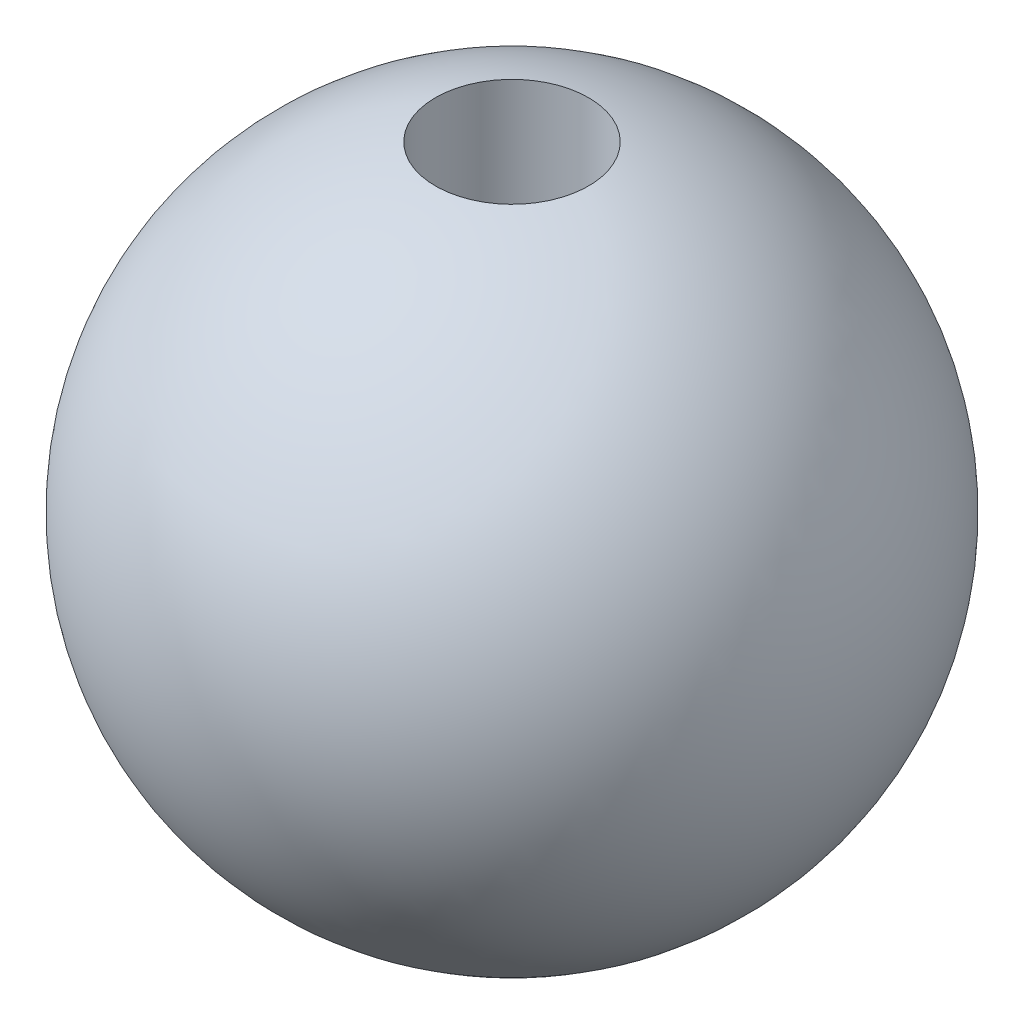
ISO-10303-21;
HEADER;
FILE_DESCRIPTION(('STEP AP214'),'2;1');
FILE_NAME('part.step','',(''),(''),'','','');
FILE_SCHEMA(('AUTOMOTIVE_DESIGN { 1 0 10303 214 1 1 1 1 }'));
ENDSEC;
DATA;
#1=APPLICATION_CONTEXT('core data for automotive mechanical design processes');
#2=APPLICATION_PROTOCOL_DEFINITION('international standard','automotive_design',2000,#1);
#3=PRODUCT_CONTEXT('',#1,'mechanical');
#4=PRODUCT('Part','Part','',(#3));
#5=PRODUCT_RELATED_PRODUCT_CATEGORY('part','',(#4));
#6=PRODUCT_DEFINITION_FORMATION('','',#4);
#7=PRODUCT_DEFINITION_CONTEXT('part definition',#1,'design');
#8=PRODUCT_DEFINITION('design','',#6,#7);
#9=PRODUCT_DEFINITION_SHAPE('','',#8);
#10=(LENGTH_UNIT() NAMED_UNIT(*) SI_UNIT(.MILLI.,.METRE.));
#11=(NAMED_UNIT(*) PLANE_ANGLE_UNIT() SI_UNIT($,.RADIAN.));
#12=(NAMED_UNIT(*) SI_UNIT($,.STERADIAN.) SOLID_ANGLE_UNIT());
#13=UNCERTAINTY_MEASURE_WITH_UNIT(LENGTH_MEASURE(1.E-05),#10,'distance_accuracy_value','');
#14=(GEOMETRIC_REPRESENTATION_CONTEXT(3) GLOBAL_UNCERTAINTY_ASSIGNED_CONTEXT((#13)) GLOBAL_UNIT_ASSIGNED_CONTEXT((#10,
#11,#12)) REPRESENTATION_CONTEXT('',''));
#15=CARTESIAN_POINT('',(0.,0.,0.));
#16=DIRECTION('',(0.,0.,1.));
#17=DIRECTION('',(1.,0.,0.));
#18=AXIS2_PLACEMENT_3D('',#15,#16,#17);
#19=CARTESIAN_POINT('',(0.,0.,0.));
#20=DIRECTION('',(0.,-1.,0.));
#21=DIRECTION('',(-1.,0.,0.));
#22=AXIS2_PLACEMENT_3D('',#19,#20,#21);
#23=SPHERICAL_SURFACE('',#22,818.);
#24=CARTESIAN_POINT('',(0.,-795.628053804037,0.));
#25=DIRECTION('',(0.,-1.,0.));
#26=DIRECTION('',(0.,0.,-1.));
#27=AXIS2_PLACEMENT_3D('',#24,#25,#26);
#28=CIRCLE('',#27,190.);
#29=CARTESIAN_POINT('',(-190.,-795.628053804037,0.));
#30=VERTEX_POINT('',#29);
#31=EDGE_CURVE('E10',#30,#30,#28,.T.);
#32=CARTESIAN_POINT('',(0.,795.628053804037,0.));
#33=DIRECTION('',(0.,-1.,0.));
#34=DIRECTION('',(0.,0.,-1.));
#35=AXIS2_PLACEMENT_3D('',#32,#33,#34);
#36=CIRCLE('',#35,190.);
#37=CARTESIAN_POINT('',(-190.,795.628053804037,0.));
#38=VERTEX_POINT('',#37);
#39=EDGE_CURVE('E52',#38,#38,#36,.T.);
#40=CARTESIAN_POINT('',(-190.,-795.628053804037,0.));
#41=CARTESIAN_POINT('',(-195.537828524181,-794.305601934005,0.));
#42=CARTESIAN_POINT('',(-201.06184534839,-792.925314797518,0.));
#43=CARTESIAN_POINT('',(-212.079857455958,-790.049711349112,0.));
#44=CARTESIAN_POINT('',(-217.573852739319,-788.554395037195,0.));
#45=CARTESIAN_POINT('',(-228.529423624287,-785.449374595412,0.));
#46=CARTESIAN_POINT('',(-233.990999225896,-783.839670465546,0.));
#47=CARTESIAN_POINT('',(-244.879350248677,-780.50657905663,0.));
#48=CARTESIAN_POINT('',(-250.30612566985,-778.78319177758,0.));
#49=CARTESIAN_POINT('',(-261.122510066138,-775.223484703968,0.));
#50=CARTESIAN_POINT('',(-266.512119041253,-773.387164909407,0.));
#51=CARTESIAN_POINT('',(-277.251820736135,-769.60239364171,0.));
#52=CARTESIAN_POINT('',(-282.601913455902,-767.653942168574,0.));
#53=CARTESIAN_POINT('',(-293.260249992363,-763.645757011401,0.));
#54=CARTESIAN_POINT('',(-298.568493809057,-761.586023327365,0.));
#55=CARTESIAN_POINT('',(-309.140818155791,-757.356171804238,0.));
#56=CARTESIAN_POINT('',(-314.404898685831,-755.186053965147,0.));
#57=CARTESIAN_POINT('',(-324.88660132597,-750.736380296545,0.));
#58=CARTESIAN_POINT('',(-330.104223436069,-748.456824467033,0.));
#59=CARTESIAN_POINT('',(-340.490734360145,-743.789268702017,0.));
#60=CARTESIAN_POINT('',(-345.659623174122,-741.401268766512,0.));
#61=CARTESIAN_POINT('',(-355.946413877082,-736.517865954094,0.));
#62=CARTESIAN_POINT('',(-361.064315766065,-734.02246307718,0.));
#63=CARTESIAN_POINT('',(-371.246901220487,-728.925342374428,0.));
#64=CARTESIAN_POINT('',(-376.311584785927,-726.32362454859,0.));
#65=CARTESIAN_POINT('',(-386.385525397811,-721.015008293557,0.));
#66=CARTESIAN_POINT('',(-391.394782444256,-718.308109864362,0.));
#67=CARTESIAN_POINT('',(-401.355685988594,-712.790312606816,0.));
#68=CARTESIAN_POINT('',(-406.307332486488,-709.979413778465,0.));
#69=CARTESIAN_POINT('',(-416.150856022291,-704.254841270838,0.));
#70=CARTESIAN_POINT('',(-421.0427330602,-701.341167591562,0.));
#71=CARTESIAN_POINT('',(-430.764584824009,-695.412315740021,0.));
#72=CARTESIAN_POINT('',(-435.594559549908,-692.397137567755,0.));
#73=CARTESIAN_POINT('',(-445.190500826997,-686.266591343996,0.));
#74=CARTESIAN_POINT('',(-449.956467378186,-683.151223292502,0.));
#75=CARTESIAN_POINT('',(-459.42231435064,-676.821655606705,0.));
#76=CARTESIAN_POINT('',(-464.122194771903,-673.607455972401,0.));
#77=CARTESIAN_POINT('',(-473.453820342752,-667.081626507845,0.));
#78=CARTESIAN_POINT('',(-478.085565492337,-663.769996677592,0.));
#79=CARTESIAN_POINT('',(-487.27890108497,-657.050750687436,0.));
#80=CARTESIAN_POINT('',(-491.840491528016,-653.643134527533,0.));
#81=CARTESIAN_POINT('',(-500.89152886007,-646.733401594289,0.));
#82=CARTESIAN_POINT('',(-505.380975749078,-643.231284820949,0.));
#83=CARTESIAN_POINT('',(-514.285768580049,-636.13407757919,0.));
#84=CARTESIAN_POINT('',(-518.701114522013,-632.538987110771,0.));
#85=CARTESIAN_POINT('',(-527.455780373808,-625.257399933624,0.));
#86=CARTESIAN_POINT('',(-531.79510028364,-621.570903224895,0.));
#87=CARTESIAN_POINT('',(-540.395822133334,-614.108110874898,0.));
#88=CARTESIAN_POINT('',(-544.657224073197,-610.33181523363,0.));
#89=CARTESIAN_POINT('',(-553.100252017251,-602.691071478542,0.));
#90=CARTESIAN_POINT('',(-557.281878021441,-598.826623364722,0.));
#91=CARTESIAN_POINT('',(-565.563530910651,-591.011259558882,0.));
#92=CARTESIAN_POINT('',(-569.66355779567,-587.060343866862,0.));
#93=CARTESIAN_POINT('',(-577.780224840148,-579.073767498725,0.));
#94=CARTESIAN_POINT('',(-581.796864999606,-575.038106822608,0.));
#95=CARTESIAN_POINT('',(-589.745007343076,-566.883800029083,0.));
#96=CARTESIAN_POINT('',(-593.676509527088,-562.765153911675,0.));
#97=CARTESIAN_POINT('',(-601.452661789827,-554.446671959919,0.));
#98=CARTESIAN_POINT('',(-605.297311868554,-550.246836125571,0.));
#99=CARTESIAN_POINT('',(-612.898083658289,-541.767805862896,0.));
#100=CARTESIAN_POINT('',(-616.654205369296,-537.488611434568,0.));
#101=CARTESIAN_POINT('',(-624.076282759411,-528.85272970714,0.));
#102=CARTESIAN_POINT('',(-627.742238438519,-524.496042408039,0.));
#103=CARTESIAN_POINT('',(-634.982385412927,-515.70707444906,0.));
#104=CARTESIAN_POINT('',(-638.556576708226,-511.274793789181,0.));
#105=CARTESIAN_POINT('',(-645.611636572262,-502.336571577249,0.));
#106=CARTESIAN_POINT('',(-649.092505140997,-497.830630025196,0.));
#107=CARTESIAN_POINT('',(-655.959401897735,-488.747050613571,0.));
#108=CARTESIAN_POINT('',(-659.345430085737,-484.169412754,0.));
#109=CARTESIAN_POINT('',(-666.021169777123,-474.944436571492,0.));
#110=CARTESIAN_POINT('',(-669.310881280506,-470.297098248555,0.));
#111=CARTESIAN_POINT('',(-675.792553292717,-460.93474737278,0.));
#112=CARTESIAN_POINT('',(-678.984513801544,-456.219734819943,0.));
#113=CARTESIAN_POINT('',(-685.269292134013,-446.724091223708,0.));
#114=CARTESIAN_POINT('',(-688.362109957654,-441.94346018031,0.));
#115=CARTESIAN_POINT('',(-694.447254455201,-432.318663951872,0.));
#116=CARTESIAN_POINT('',(-697.439581129108,-427.474498766831,0.));
#117=CARTESIAN_POINT('',(-703.322438676647,-417.724746304828,0.));
#118=CARTESIAN_POINT('',(-706.212969550281,-412.819159027864,0.));
#119=CARTESIAN_POINT('',(-711.890975229573,-402.948701211688,0.));
#120=CARTESIAN_POINT('',(-714.678450035232,-397.983830672475,0.));
#121=CARTESIAN_POINT('',(-720.149128243186,-387.996971008897,0.));
#122=CARTESIAN_POINT('',(-722.83233164548,-382.974981884531,0.));
#123=CARTESIAN_POINT('',(-728.093297173512,-372.876074631375,0.));
#124=CARTESIAN_POINT('',(-730.671059299249,-367.799156502584,0.));
#125=CARTESIAN_POINT('',(-735.72001837323,-357.592604770278,0.));
#126=CARTESIAN_POINT('',(-738.191215321475,-352.462971166762,0.));
#127=CARTESIAN_POINT('',(-743.025966601818,-342.153224998586,0.));
#128=CARTESIAN_POINT('',(-745.389520933915,-336.973112433926,0.));
#129=CARTESIAN_POINT('',(-750.007956475348,-326.564666865801,0.));
#130=CARTESIAN_POINT('',(-752.262837684683,-321.336333862336,0.));
#131=CARTESIAN_POINT('',(-756.662943855317,-310.833726962993,0.));
#132=CARTESIAN_POINT('',(-758.808168816615,-305.559453067114,0.));
#133=CARTESIAN_POINT('',(-762.988027175883,-294.9672639595,0.));
#134=CARTESIAN_POINT('',(-765.022660573851,-289.649348747765,0.));
#135=CARTESIAN_POINT('',(-768.980448708944,-278.972195612556,0.));
#136=CARTESIAN_POINT('',(-770.903603446067,-273.612957689081,0.));
#137=CARTESIAN_POINT('',(-774.637595766506,-262.855495751157,0.));
#138=CARTESIAN_POINT('',(-776.44843334982,-257.457271736707,0.));
#139=CARTESIAN_POINT('',(-779.957001839809,-246.62419123548,0.));
#140=CARTESIAN_POINT('',(-781.654732746483,-241.189334748704,0.));
#141=CARTESIAN_POINT('',(-784.936347674724,-230.285358893186,0.));
#142=CARTESIAN_POINT('',(-786.520231696291,-224.816239524443,0.));
#143=CARTESIAN_POINT('',(-789.573462282943,-213.846122433923,0.));
#144=CARTESIAN_POINT('',(-791.042808848029,-208.345124712145,0.));
#145=CARTESIAN_POINT('',(-793.866323888528,-197.313649343408,0.));
#146=CARTESIAN_POINT('',(-795.220492363941,-191.783171696448,0.));
#147=CARTESIAN_POINT('',(-797.813060809402,-180.695147758406,0.));
#148=CARTESIAN_POINT('',(-799.051460779449,-175.137601467324,0.));
#149=CARTESIAN_POINT('',(-801.411952273401,-163.997863323993,0.));
#150=CARTESIAN_POINT('',(-802.534043797305,-158.415671471745,0.));
#151=CARTESIAN_POINT('',(-804.661429168526,-147.229076034468,0.));
#152=CARTESIAN_POINT('',(-805.666723015843,-141.62467244944,0.));
#153=CARTESIAN_POINT('',(-807.560074727079,-130.396097059278,0.));
#154=CARTESIAN_POINT('',(-808.448132590999,-124.771925254144,0.));
#155=CARTESIAN_POINT('',(-810.106625143366,-113.506265555364,0.));
#156=CARTESIAN_POINT('',(-810.877059831814,-107.864777661717,0.));
#157=CARTESIAN_POINT('',(-812.299970124717,-96.5669454672935,0.));
#158=CARTESIAN_POINT('',(-812.952445729171,-90.9106011665175,0.));
#159=CARTESIAN_POINT('',(-814.139153375572,-79.585522316595,0.));
#160=CARTESIAN_POINT('',(-814.673385417519,-73.9167877674484,0.));
#161=CARTESIAN_POINT('',(-815.623373014427,-62.5693999816755,0.));
#162=CARTESIAN_POINT('',(-816.03912856939,-56.8907467450492,0.));
#163=CARTESIAN_POINT('',(-816.75198192345,-45.525997469742,0.));
#164=CARTESIAN_POINT('',(-817.049079722548,-39.8399014310612,0.));
#165=CARTESIAN_POINT('',(-817.524488030624,-28.4627456821229,0.));
#166=CARTESIAN_POINT('',(-817.702798539602,-22.7716859718653,0.));
#167=CARTESIAN_POINT('',(-817.94055452429,-11.3870841744051,0.));
#168=CARTESIAN_POINT('',(-818.,-5.69354208720244,0.));
#169=CARTESIAN_POINT('',(-818.,5.6935420872028,0.));
#170=CARTESIAN_POINT('',(-817.940554524291,11.3870841744054,0.));
#171=CARTESIAN_POINT('',(-817.702798539602,22.7716859718656,0.));
#172=CARTESIAN_POINT('',(-817.524488030624,28.4627456821232,0.));
#173=CARTESIAN_POINT('',(-817.049079722548,39.8399014310616,0.));
#174=CARTESIAN_POINT('',(-816.75198192345,45.5259974697424,0.));
#175=CARTESIAN_POINT('',(-816.03912856939,56.8907467450495,0.));
#176=CARTESIAN_POINT('',(-815.623373014427,62.5693999816759,0.));
#177=CARTESIAN_POINT('',(-814.673385417519,73.9167877674488,0.));
#178=CARTESIAN_POINT('',(-814.139153375572,79.5855223165954,0.));
#179=CARTESIAN_POINT('',(-812.952445729171,90.9106011665179,0.));
#180=CARTESIAN_POINT('',(-812.299970124716,96.5669454672939,0.));
#181=CARTESIAN_POINT('',(-810.877059831814,107.864777661717,0.));
#182=CARTESIAN_POINT('',(-810.106625143366,113.506265555364,0.));
#183=CARTESIAN_POINT('',(-808.448132590999,124.771925254145,0.));
#184=CARTESIAN_POINT('',(-807.560074727079,130.396097059278,0.));
#185=CARTESIAN_POINT('',(-805.666723015843,141.62467244944,0.));
#186=CARTESIAN_POINT('',(-804.661429168526,147.229076034468,0.));
#187=CARTESIAN_POINT('',(-802.534043797305,158.415671471745,0.));
#188=CARTESIAN_POINT('',(-801.411952273401,163.997863323994,0.));
#189=CARTESIAN_POINT('',(-799.051460779449,175.137601467324,0.));
#190=CARTESIAN_POINT('',(-797.813060809402,180.695147758406,0.));
#191=CARTESIAN_POINT('',(-795.220492363941,191.783171696448,0.));
#192=CARTESIAN_POINT('',(-793.866323888528,197.313649343408,0.));
#193=CARTESIAN_POINT('',(-791.042808848029,208.345124712146,0.));
#194=CARTESIAN_POINT('',(-789.573462282943,213.846122433923,0.));
#195=CARTESIAN_POINT('',(-786.520231696291,224.816239524443,0.));
#196=CARTESIAN_POINT('',(-784.936347674724,230.285358893186,0.));
#197=CARTESIAN_POINT('',(-781.654732746483,241.189334748705,0.));
#198=CARTESIAN_POINT('',(-779.957001839809,246.624191235481,0.));
#199=CARTESIAN_POINT('',(-776.44843334982,257.457271736707,0.));
#200=CARTESIAN_POINT('',(-774.637595766506,262.855495751157,0.));
#201=CARTESIAN_POINT('',(-770.903603446067,273.612957689082,0.));
#202=CARTESIAN_POINT('',(-768.980448708944,278.972195612556,0.));
#203=CARTESIAN_POINT('',(-765.022660573851,289.649348747766,0.));
#204=CARTESIAN_POINT('',(-762.988027175882,294.9672639595,0.));
#205=CARTESIAN_POINT('',(-758.808168816615,305.559453067114,0.));
#206=CARTESIAN_POINT('',(-756.662943855317,310.833726962993,0.));
#207=CARTESIAN_POINT('',(-752.262837684683,321.336333862337,0.));
#208=CARTESIAN_POINT('',(-750.007956475348,326.564666865801,0.));
#209=CARTESIAN_POINT('',(-745.389520933915,336.973112433926,0.));
#210=CARTESIAN_POINT('',(-743.025966601818,342.153224998587,0.));
#211=CARTESIAN_POINT('',(-738.191215321475,352.462971166763,0.));
#212=CARTESIAN_POINT('',(-735.72001837323,357.592604770278,0.));
#213=CARTESIAN_POINT('',(-730.671059299248,367.799156502584,0.));
#214=CARTESIAN_POINT('',(-728.093297173512,372.876074631375,0.));
#215=CARTESIAN_POINT('',(-722.83233164548,382.974981884532,0.));
#216=CARTESIAN_POINT('',(-720.149128243185,387.996971008897,0.));
#217=CARTESIAN_POINT('',(-714.678450035232,397.983830672476,0.));
#218=CARTESIAN_POINT('',(-711.890975229573,402.948701211689,0.));
#219=CARTESIAN_POINT('',(-706.21296955028,412.819159027865,0.));
#220=CARTESIAN_POINT('',(-703.322438676647,417.724746304828,0.));
#221=CARTESIAN_POINT('',(-697.439581129107,427.474498766831,0.));
#222=CARTESIAN_POINT('',(-694.447254455201,432.318663951872,0.));
#223=CARTESIAN_POINT('',(-688.362109957654,441.94346018031,0.));
#224=CARTESIAN_POINT('',(-685.269292134013,446.724091223708,0.));
#225=CARTESIAN_POINT('',(-678.984513801544,456.219734819943,0.));
#226=CARTESIAN_POINT('',(-675.792553292717,460.934747372781,0.));
#227=CARTESIAN_POINT('',(-669.310881280506,470.297098248555,0.));
#228=CARTESIAN_POINT('',(-666.021169777123,474.944436571492,0.));
#229=CARTESIAN_POINT('',(-659.345430085737,484.169412754,0.));
#230=CARTESIAN_POINT('',(-655.959401897734,488.747050613572,0.));
#231=CARTESIAN_POINT('',(-649.092505140997,497.830630025196,0.));
#232=CARTESIAN_POINT('',(-645.611636572261,502.33657157725,0.));
#233=CARTESIAN_POINT('',(-638.556576708226,511.274793789182,0.));
#234=CARTESIAN_POINT('',(-634.982385412926,515.70707444906,0.));
#235=CARTESIAN_POINT('',(-627.742238438519,524.49604240804,0.));
#236=CARTESIAN_POINT('',(-624.076282759411,528.852729707141,0.));
#237=CARTESIAN_POINT('',(-616.654205369296,537.488611434569,0.));
#238=CARTESIAN_POINT('',(-612.898083658288,541.767805862896,0.));
#239=CARTESIAN_POINT('',(-605.297311868554,550.246836125571,0.));
#240=CARTESIAN_POINT('',(-601.452661789827,554.44667195992,0.));
#241=CARTESIAN_POINT('',(-593.676509527088,562.765153911675,0.));
#242=CARTESIAN_POINT('',(-589.745007343076,566.883800029083,0.));
#243=CARTESIAN_POINT('',(-581.796864999606,575.038106822608,0.));
#244=CARTESIAN_POINT('',(-577.780224840147,579.073767498725,0.));
#245=CARTESIAN_POINT('',(-569.66355779567,587.060343866862,0.));
#246=CARTESIAN_POINT('',(-565.563530910651,591.011259558882,0.));
#247=CARTESIAN_POINT('',(-557.281878021441,598.826623364722,0.));
#248=CARTESIAN_POINT('',(-553.100252017251,602.691071478542,0.));
#249=CARTESIAN_POINT('',(-544.657224073197,610.33181523363,0.));
#250=CARTESIAN_POINT('',(-540.395822133334,614.108110874898,0.));
#251=CARTESIAN_POINT('',(-531.795100283639,621.570903224895,0.));
#252=CARTESIAN_POINT('',(-527.455780373808,625.257399933624,0.));
#253=CARTESIAN_POINT('',(-518.701114522012,632.538987110771,0.));
#254=CARTESIAN_POINT('',(-514.285768580049,636.13407757919,0.));
#255=CARTESIAN_POINT('',(-505.380975749078,643.231284820949,0.));
#256=CARTESIAN_POINT('',(-500.89152886007,646.733401594289,0.));
#257=CARTESIAN_POINT('',(-491.840491528016,653.643134527533,0.));
#258=CARTESIAN_POINT('',(-487.278901084969,657.050750687436,0.));
#259=CARTESIAN_POINT('',(-478.085565492337,663.769996677592,0.));
#260=CARTESIAN_POINT('',(-473.453820342751,667.081626507845,0.));
#261=CARTESIAN_POINT('',(-464.122194771903,673.607455972401,0.));
#262=CARTESIAN_POINT('',(-459.422314350639,676.821655606705,0.));
#263=CARTESIAN_POINT('',(-449.956467378186,683.151223292502,0.));
#264=CARTESIAN_POINT('',(-445.190500826996,686.266591343996,0.));
#265=CARTESIAN_POINT('',(-435.594559549907,692.397137567755,0.));
#266=CARTESIAN_POINT('',(-430.764584824008,695.412315740021,0.));
#267=CARTESIAN_POINT('',(-421.0427330602,701.341167591562,0.));
#268=CARTESIAN_POINT('',(-416.150856022291,704.254841270838,0.));
#269=CARTESIAN_POINT('',(-406.307332486488,709.979413778465,0.));
#270=CARTESIAN_POINT('',(-401.355685988594,712.790312606816,0.));
#271=CARTESIAN_POINT('',(-391.394782444256,718.308109864362,0.));
#272=CARTESIAN_POINT('',(-386.385525397811,721.015008293557,0.));
#273=CARTESIAN_POINT('',(-376.311584785926,726.32362454859,0.));
#274=CARTESIAN_POINT('',(-371.246901220487,728.925342374428,0.));
#275=CARTESIAN_POINT('',(-361.064315766064,734.02246307718,0.));
#276=CARTESIAN_POINT('',(-355.946413877082,736.517865954094,0.));
#277=CARTESIAN_POINT('',(-345.659623174122,741.401268766512,0.));
#278=CARTESIAN_POINT('',(-340.490734360144,743.789268702017,0.));
#279=CARTESIAN_POINT('',(-330.104223436068,748.456824467034,0.));
#280=CARTESIAN_POINT('',(-324.88660132597,750.736380296545,0.));
#281=CARTESIAN_POINT('',(-314.404898685831,755.186053965147,0.));
#282=CARTESIAN_POINT('',(-309.14081815579,757.356171804238,0.));
#283=CARTESIAN_POINT('',(-298.568493809057,761.586023327365,0.));
#284=CARTESIAN_POINT('',(-293.260249992363,763.645757011401,0.));
#285=CARTESIAN_POINT('',(-282.601913455902,767.653942168574,0.));
#286=CARTESIAN_POINT('',(-277.251820736135,769.60239364171,0.));
#287=CARTESIAN_POINT('',(-266.512119041252,773.387164909407,0.));
#288=CARTESIAN_POINT('',(-261.122510066138,775.223484703968,0.));
#289=CARTESIAN_POINT('',(-250.30612566985,778.78319177758,0.));
#290=CARTESIAN_POINT('',(-244.879350248677,780.50657905663,0.));
#291=CARTESIAN_POINT('',(-233.990999225895,783.839670465547,0.));
#292=CARTESIAN_POINT('',(-228.529423624287,785.449374595412,0.));
#293=CARTESIAN_POINT('',(-217.573852739318,788.554395037195,0.));
#294=CARTESIAN_POINT('',(-212.079857455958,790.049711349112,0.));
#295=CARTESIAN_POINT('',(-201.061845348389,792.925314797518,0.));
#296=CARTESIAN_POINT('',(-195.537828524181,794.305601934005,0.));
#297=CARTESIAN_POINT('',(-190.,795.628053804037,0.));
#298=B_SPLINE_CURVE_WITH_KNOTS('',3,(#40,#41,#42,#43,#44,#45,#46,#47,#48,#49,#50,#51,#52,#53,
#54,#55,#56,#57,#58,#59,#60,#61,#62,#63,#64,#65,#66,#67,#68,#69,#70,#71,#72,#73,#74,#75,#76,#77,
#78,#79,#80,#81,#82,#83,#84,#85,#86,#87,#88,#89,#90,#91,#92,#93,#94,#95,#96,#97,#98,#99,#100,
#101,#102,#103,#104,#105,#106,#107,#108,#109,#110,#111,#112,#113,#114,#115,#116,#117,#118,#119,
#120,#121,#122,#123,#124,#125,#126,#127,#128,#129,#130,#131,#132,#133,#134,#135,#136,#137,#138,
#139,#140,#141,#142,#143,#144,#145,#146,#147,#148,#149,#150,#151,#152,#153,#154,#155,#156,#157,
#158,#159,#160,#161,#162,#163,#164,#165,#166,#167,#168,#169,#170,#171,#172,#173,#174,#175,#176,
#177,#178,#179,#180,#181,#182,#183,#184,#185,#186,#187,#188,#189,#190,#191,#192,#193,#194,#195,
#196,#197,#198,#199,#200,#201,#202,#203,#204,#205,#206,#207,#208,#209,#210,#211,#212,#213,#214,
#215,#216,#217,#218,#219,#220,#221,#222,#223,#224,#225,#226,#227,#228,#229,#230,#231,#232,#233,
#234,#235,#236,#237,#238,#239,#240,#241,#242,#243,#244,#245,#246,#247,#248,#249,#250,#251,#252,
#253,#254,#255,#256,#257,#258,#259,#260,#261,#262,#263,#264,#265,#266,#267,#268,#269,#270,#271,
#272,#273,#274,#275,#276,#277,#278,#279,#280,#281,#282,#283,#284,#285,#286,#287,#288,#289,#290,
#291,#292,#293,#294,#295,#296,#297),.UNSPECIFIED.,.F.,.F.,(4,2,2,2,2,2,2,2,2,2,2,2,2,2,2,2,2,2,
2,2,2,2,2,2,2,2,2,2,2,2,2,2,2,2,2,2,2,2,2,2,2,2,2,2,2,2,2,2,2,2,2,2,2,2,2,2,2,2,2,2,2,2,2,2,2,2,
2,2,2,2,2,2,2,2,2,2,2,2,2,2,2,2,2,2,2,2,2,2,2,2,2,2,2,2,2,2,2,2,2,2,2,2,2,2,2,2,2,2,2,2,2,2,2,2,
2,2,2,2,2,2,2,2,2,2,2,2,2,2,4),(0.,17.0803159729467,34.1606319458932,51.2409479188399,
68.3212638917864,85.4015798647332,102.48189583768,119.562211810626,136.642527783573,
153.72284375652,170.803159729466,187.883475702413,204.963791675359,222.044107648306,
239.124423621253,256.204739594199,273.285055567146,290.365371540092,307.445687513039,
324.526003485986,341.606319458932,358.686635431879,375.766951404826,392.847267377772,
409.927583350719,427.007899323666,444.088215296612,461.168531269559,478.248847242506,
495.329163215452,512.409479188399,529.489795161345,546.570111134292,563.650427107239,
580.730743080185,597.811059053132,614.891375026078,631.971690999025,649.052006971972,
666.132322944918,683.212638917865,700.292954890812,717.373270863758,734.453586836705,
751.533902809652,768.614218782598,785.694534755545,802.774850728491,819.855166701438,
836.935482674385,854.015798647331,871.096114620278,888.176430593225,905.256746566171,
922.337062539118,939.417378512064,956.497694485011,973.578010457958,990.658326430904,
1007.73864240385,1024.8189583768,1041.89927434974,1058.97959032269,1076.05990629564,
1093.14022226858,1110.22053824153,1127.30085421448,1144.38117018742,1161.46148616037,
1178.54180213332,1195.62211810626,1212.70243407921,1229.78275005216,1246.8630660251,
1263.94338199805,1281.023697971,1298.10401394394,1315.18432991689,1332.26464588984,
1349.34496186278,1366.42527783573,1383.50559380868,1400.58590978162,1417.66622575457,
1434.74654172752,1451.82685770046,1468.90717367341,1485.98748964636,1503.0678056193,
1520.14812159225,1537.2284375652,1554.30875353814,1571.38906951109,1588.46938548403,
1605.54970145698,1622.63001742993,1639.71033340287,1656.79064937582,1673.87096534877,
1690.95128132171,1708.03159729466,1725.11191326761,1742.19222924055,1759.2725452135,
1776.35286118645,1793.43317715939,1810.51349313234,1827.59380910529,1844.67412507823,
1861.75444105118,1878.83475702413,1895.91507299707,1912.99538897002,1930.07570494297,
1947.15602091591,1964.23633688886,1981.31665286181,1998.39696883475,2015.4772848077,
2032.55760078065,2049.63791675359,2066.71823272654,2083.79854869949,2100.87886467243,
2117.95918064538,2135.03949661833,2152.11981259127,2169.20012856422,2186.28044453717),.UNSPECIFIED.);
#299=EDGE_CURVE('BSEAM33',#30,#38,#298,.T.);
#300=ORIENTED_EDGE('',*,*,#31,.F.);
#301=ORIENTED_EDGE('',*,*,#39,.T.);
#302=ORIENTED_EDGE('',*,*,#299,.T.);
#303=ORIENTED_EDGE('',*,*,#299,.F.);
#304=EDGE_LOOP('',(#300,#302,#301,#303));
#305=FACE_BOUND('',#304,.T.);
#306=ADVANCED_FACE('F33',(#305),#23,.T.);
#307=CARTESIAN_POINT('',(0.,0.,0.));
#308=DIRECTION('',(0.,-1.,0.));
#309=DIRECTION('',(0.,0.,-1.));
#310=AXIS2_PLACEMENT_3D('',#307,#308,#309);
#311=CYLINDRICAL_SURFACE('',#310,190.);
#312=CARTESIAN_POINT('',(0.,-373.169638012031,0.));
#313=DIRECTION('',(0.,-1.,0.));
#314=DIRECTION('',(0.,0.,-1.));
#315=AXIS2_PLACEMENT_3D('',#312,#313,#314);
#316=CIRCLE('',#315,190.);
#317=CARTESIAN_POINT('',(-190.,-373.169638012031,0.));
#318=VERTEX_POINT('',#317);
#319=EDGE_CURVE('E39',#318,#318,#316,.T.);
#320=ORIENTED_EDGE('',*,*,#319,.F.);
#321=EDGE_LOOP('',(#320));
#322=FACE_BOUND('',#321,.T.);
#323=ORIENTED_EDGE('',*,*,#31,.T.);
#324=EDGE_LOOP('',(#323));
#325=FACE_BOUND('',#324,.T.);
#326=ADVANCED_FACE('F71',(#322,#325),#311,.F.);
#327=CARTESIAN_POINT('',(0.,-167.5,0.));
#328=DIRECTION('',(0.,-1.,0.));
#329=DIRECTION('',(-1.,0.,0.));
#330=AXIS2_PLACEMENT_3D('',#327,#328,#329);
#331=SPHERICAL_SURFACE('',#330,280.);
#332=CARTESIAN_POINT('',(0.,-51.5111940298507,0.));
#333=DIRECTION('',(0.,-1.,0.));
#334=DIRECTION('',(0.,0.,-1.));
#335=AXIS2_PLACEMENT_3D('',#332,#333,#334);
#336=CIRCLE('',#335,254.846222043057);
#337=CARTESIAN_POINT('',(-254.846222043057,-51.5111940298507,0.));
#338=VERTEX_POINT('',#337);
#339=EDGE_CURVE('E43',#338,#338,#336,.T.);
#340=CARTESIAN_POINT('',(-254.846222043057,-51.5111940298507,0.));
#341=CARTESIAN_POINT('',(-255.602624902995,-53.1731278887848,0.));
#342=CARTESIAN_POINT('',(-256.342766316562,-54.8424627695597,0.));
#343=CARTESIAN_POINT('',(-257.790252871302,-58.1952913849546,0.));
#344=CARTESIAN_POINT('',(-258.497598012476,-59.8787851195746,0.));
#345=CARTESIAN_POINT('',(-259.879218642783,-63.2592882528228,0.));
#346=CARTESIAN_POINT('',(-260.553494131917,-64.956297651451,0.));
#347=CARTESIAN_POINT('',(-261.868718098857,-68.3631822978894,0.));
#348=CARTESIAN_POINT('',(-262.509666576664,-70.0730575456996,0.));
#349=CARTESIAN_POINT('',(-263.757991015924,-73.5050195405163,0.));
#350=CARTESIAN_POINT('',(-264.365366977376,-75.2271062875229,0.));
#351=CARTESIAN_POINT('',(-265.546313969815,-78.6828321527044,0.));
#352=CARTESIAN_POINT('',(-266.119885000802,-80.4164712708793,0.));
#353=CARTESIAN_POINT('',(-267.233002591888,-83.8946383567857,0.));
#354=CARTESIAN_POINT('',(-267.772549151987,-85.6391663245172,0.));
#355=CARTESIAN_POINT('',(-268.817411300627,-89.1384434128768,0.));
#356=CARTESIAN_POINT('',(-269.322726889169,-90.8931925335049,0.));
#357=CARTESIAN_POINT('',(-270.298933690835,-94.4122403209915,0.));
#358=CARTESIAN_POINT('',(-270.769824903959,-96.17653898785,0.));
#359=CARTESIAN_POINT('',(-271.67700272765,-99.714010605631,0.));
#360=CARTESIAN_POINT('',(-272.113289338216,-101.487183556554,0.));
#361=CARTESIAN_POINT('',(-272.951090973774,-105.041725083925,0.));
#362=CARTESIAN_POINT('',(-273.352605998764,-106.823093660374,0.));
#363=CARTESIAN_POINT('',(-274.120710788606,-110.393344643455,0.));
#364=CARTESIAN_POINT('',(-274.487300553458,-112.182227050087,0.));
#365=CARTESIAN_POINT('',(-275.185414515618,-115.76682102238,0.));
#366=CARTESIAN_POINT('',(-275.516938712926,-117.562532588041,0.));
#367=CARTESIAN_POINT('',(-276.144794653485,-121.160097593467,0.));
#368=CARTESIAN_POINT('',(-276.441126396736,-122.961951033232,0.));
#369=CARTESIAN_POINT('',(-276.998484012113,-126.571110151219,0.));
#370=CARTESIAN_POINT('',(-277.259509884239,-128.37841582944,0.));
#371=CARTESIAN_POINT('',(-277.746155853154,-131.99778770192,0.));
#372=CARTESIAN_POINT('',(-277.971775949944,-133.809853896179,0.));
#373=CARTESIAN_POINT('',(-278.38752401507,-137.43805325629,0.));
#374=CARTESIAN_POINT('',(-278.577651983406,-139.254186422142,0.));
#375=CARTESIAN_POINT('',(-278.922343022651,-142.889824624415,0.));
#376=CARTESIAN_POINT('',(-279.076906093561,-144.709329660836,0.));
#377=CARTESIAN_POINT('',(-279.350408180976,-148.351015212685,0.));
#378=CARTESIAN_POINT('',(-279.469347197481,-150.173195728112,0.));
#379=CARTESIAN_POINT('',(-279.671555653748,-153.819534822406,0.));
#380=CARTESIAN_POINT('',(-279.754825093509,-155.643693401273,0.));
#381=CARTESIAN_POINT('',(-279.885662526006,-159.2932904498,0.));
#382=CARTESIAN_POINT('',(-279.933230518742,-161.118728919461,0.));
#383=CARTESIAN_POINT('',(-279.992646851168,-164.770187087071,0.));
#384=CARTESIAN_POINT('',(-280.004495190858,-166.59620678502,0.));
#385=CARTESIAN_POINT('',(-279.992467682395,-170.248128524242,0.));
#386=CARTESIAN_POINT('',(-279.968591834242,-172.074030565515,0.));
#387=CARTESIAN_POINT('',(-279.88512508826,-175.725018151454,0.));
#388=CARTESIAN_POINT('',(-279.825534190431,-177.550103696119,0.));
#389=CARTESIAN_POINT('',(-279.670660152726,-181.198759761414,0.));
#390=CARTESIAN_POINT('',(-279.575377012851,-183.022330282042,0.));
#391=CARTESIAN_POINT('',(-279.34915495942,-186.66725835169,0.));
#392=CARTESIAN_POINT('',(-279.218216045865,-188.488615900709,0.));
#393=CARTESIAN_POINT('',(-278.920732560216,-192.128420926549,0.));
#394=CARTESIAN_POINT('',(-278.754187988122,-193.94686840337,0.));
#395=CARTESIAN_POINT('',(-278.385556928137,-197.580157298019,0.));
#396=CARTESIAN_POINT('',(-278.183470440245,-199.394998715846,0.));
#397=CARTESIAN_POINT('',(-277.743832894602,-203.020380885883,0.));
#398=CARTESIAN_POINT('',(-277.50628183685,-204.830921638093,0.));
#399=CARTESIAN_POINT('',(-276.995806071022,-208.447009516293,0.));
#400=CARTESIAN_POINT('',(-276.722881362946,-210.252556642284,0.));
#401=CARTESIAN_POINT('',(-276.141762754802,-213.857966218688,0.));
#402=CARTESIAN_POINT('',(-275.833568854735,-215.657828669103,0.));
#403=CARTESIAN_POINT('',(-275.182029819762,-219.251180020734,0.));
#404=CARTESIAN_POINT('',(-274.838684684855,-221.044668921951,0.));
#405=CARTESIAN_POINT('',(-274.116974591027,-224.624586740956,0.));
#406=CARTESIAN_POINT('',(-273.738609632105,-226.411015658744,0.));
#407=CARTESIAN_POINT('',(-272.947004704444,-229.976129778778,0.));
#408=CARTESIAN_POINT('',(-272.533764735706,-231.754814981024,0.));
#409=CARTESIAN_POINT('',(-271.672567950562,-235.303760901663,0.));
#410=CARTESIAN_POINT('',(-271.224611134157,-237.074021620057,0.));
#411=CARTESIAN_POINT('',(-270.294152103245,-240.605441029042,0.));
#412=CARTESIAN_POINT('',(-269.811649888738,-242.366599719634,0.));
#413=CARTESIAN_POINT('',(-268.812284732983,-245.879141012747,0.));
#414=CARTESIAN_POINT('',(-268.295421791736,-247.630523615269,0.));
#415=CARTESIAN_POINT('',(-267.227533004976,-251.122842413643,0.));
#416=CARTESIAN_POINT('',(-266.676507159464,-252.863778609495,0.));
#417=CARTESIAN_POINT('',(-265.540503462052,-256.334538274155,0.));
#418=CARTESIAN_POINT('',(-264.955525610153,-258.064361742963,0.));
#419=CARTESIAN_POINT('',(-263.751841792526,-261.512233886408,0.));
#420=CARTESIAN_POINT('',(-263.1331358268,-263.230282561046,0.));
#421=CARTESIAN_POINT('',(-261.862232583069,-266.653947555674,0.));
#422=CARTESIAN_POINT('',(-261.210035305066,-268.359563875663,0.));
#423=CARTESIAN_POINT('',(-259.872399056691,-271.757711358837,0.));
#424=CARTESIAN_POINT('',(-259.18696008632,-273.45024252202,0.));
#425=CARTESIAN_POINT('',(-257.783102795939,-276.821571897594,0.));
#426=CARTESIAN_POINT('',(-257.064684475929,-278.500370109985,0.));
#427=CARTESIAN_POINT('',(-255.59514345141,-281.843591046091,0.));
#428=CARTESIAN_POINT('',(-254.844020746901,-283.508013769807,0.));
#429=CARTESIAN_POINT('',(-253.309358435696,-286.821846692712,0.));
#430=CARTESIAN_POINT('',(-252.525818828999,-288.471256891901,0.));
#431=CARTESIAN_POINT('',(-250.926622602872,-291.754433475745,0.));
#432=CARTESIAN_POINT('',(-250.110965983442,-293.388199860401,0.));
#433=CARTESIAN_POINT('',(-248.447847913664,-296.639463512635,0.));
#434=CARTESIAN_POINT('',(-247.600386463317,-298.256960780215,0.));
#435=CARTESIAN_POINT('',(-245.873983086402,-301.475067122544,0.));
#436=CARTESIAN_POINT('',(-244.995041159835,-303.075676197294,0.));
#437=CARTESIAN_POINT('',(-243.206013233913,-306.259393541945,0.));
#438=CARTESIAN_POINT('',(-242.295927234558,-307.842501811847,0.));
#439=CARTESIAN_POINT('',(-240.44495948648,-310.990611632983,0.));
#440=CARTESIAN_POINT('',(-239.504077737756,-312.555613184219,0.));
#441=CARTESIAN_POINT('',(-237.591878601022,-315.666910584313,0.));
#442=CARTESIAN_POINT('',(-236.620561213012,-317.213206433173,0.));
#443=CARTESIAN_POINT('',(-234.64786255663,-320.286500604168,0.));
#444=CARTESIAN_POINT('',(-233.646481288258,-321.813498926304,0.));
#445=CARTESIAN_POINT('',(-231.614038136629,-324.847613605376,0.));
#446=CARTESIAN_POINT('',(-230.582976253372,-326.354729962312,0.));
#447=CARTESIAN_POINT('',(-228.491566497317,-329.348503882073,0.));
#448=CARTESIAN_POINT('',(-227.431218624519,-330.835161444899,0.));
#449=CARTESIAN_POINT('',(-225.281642723538,-333.787448777845,0.));
#450=CARTESIAN_POINT('',(-224.192414695354,-335.253078547964,0.));
#451=CARTESIAN_POINT('',(-221.985495371319,-338.162749345083,0.));
#452=CARTESIAN_POINT('',(-220.867804075468,-339.606790372081,0.));
#453=CARTESIAN_POINT('',(-218.604385997507,-342.472730995087,0.));
#454=CARTESIAN_POINT('',(-217.458659215398,-343.894630591095,0.));
#455=CARTESIAN_POINT('',(-215.139608677481,-346.715744139566,0.));
#456=CARTESIAN_POINT('',(-213.966284921674,-348.11495809203,0.));
#457=CARTESIAN_POINT('',(-211.592489507794,-350.890164819845,0.));
#458=CARTESIAN_POINT('',(-210.392017849722,-352.266157595196,0.));
#459=CARTESIAN_POINT('',(-207.964386106329,-354.994395336432,0.));
#460=CARTESIAN_POINT('',(-206.737226021009,-356.346640302318,0.));
#461=CARTESIAN_POINT('',(-204.256687063955,-359.02686483061,0.));
#462=CARTESIAN_POINT('',(-203.003308192221,-360.354844393016,0.));
#463=CARTESIAN_POINT('',(-200.470811520294,-362.986029997269,0.));
#464=CARTESIAN_POINT('',(-199.191693720101,-364.289236039117,0.));
#465=CARTESIAN_POINT('',(-196.60820822037,-366.870375259049,0.));
#466=CARTESIAN_POINT('',(-195.303840520832,-368.148308437134,0.));
#467=CARTESIAN_POINT('',(-192.670356453668,-370.678414900973,0.));
#468=CARTESIAN_POINT('',(-191.341240086042,-371.930588186727,0.));
#469=CARTESIAN_POINT('',(-190.,-373.169638012031,0.));
#470=B_SPLINE_CURVE_WITH_KNOTS('',3,(#340,#341,#342,#343,#344,#345,#346,#347,#348,#349,#350,
#351,#352,#353,#354,#355,#356,#357,#358,#359,#360,#361,#362,#363,#364,#365,#366,#367,#368,#369,
#370,#371,#372,#373,#374,#375,#376,#377,#378,#379,#380,#381,#382,#383,#384,#385,#386,#387,#388,
#389,#390,#391,#392,#393,#394,#395,#396,#397,#398,#399,#400,#401,#402,#403,#404,#405,#406,#407,
#408,#409,#410,#411,#412,#413,#414,#415,#416,#417,#418,#419,#420,#421,#422,#423,#424,#425,#426,
#427,#428,#429,#430,#431,#432,#433,#434,#435,#436,#437,#438,#439,#440,#441,#442,#443,#444,#445,
#446,#447,#448,#449,#450,#451,#452,#453,#454,#455,#456,#457,#458,#459,#460,#461,#462,#463,#464,
#465,#466,#467,#468,#469),.UNSPECIFIED.,.F.,.F.,(4,2,2,2,2,2,2,2,2,2,2,2,2,2,2,2,2,2,2,2,2,2,2,
2,2,2,2,2,2,2,2,2,2,2,2,2,2,2,2,2,2,2,2,2,2,2,2,2,2,2,2,2,2,2,2,2,2,2,2,2,2,2,2,2,4),(0.,
5.47782496177566,10.9556499235513,16.433474885327,21.9112998471026,27.3891248088783,
32.8669497706539,38.3447747324296,43.8225996942052,49.3004246559809,54.7782496177566,
60.2560745795322,65.7338995413079,71.2117245030835,76.6895494648592,82.1673744266348,
87.6451993884105,93.1230243501861,98.6008493119618,104.078674273737,109.556499235513,
115.034324197289,120.512149159064,125.98997412084,131.467799082616,136.945624044391,
142.423449006167,147.901273967943,153.379098929718,158.856923891494,164.33474885327,
169.812573815045,175.290398776821,180.768223738597,186.246048700372,191.723873662148,
197.201698623924,202.679523585699,208.157348547475,213.635173509251,219.112998471026,
224.590823432802,230.068648394578,235.546473356353,241.024298318129,246.502123279904,
251.97994824168,257.457773203456,262.935598165232,268.413423127007,273.891248088783,
279.369073050558,284.846898012334,290.32472297411,295.802547935885,301.280372897661,
306.758197859437,312.236022821212,317.713847782988,323.191672744764,328.669497706539,
334.147322668315,339.625147630091,345.102972591866,350.580797553642),.UNSPECIFIED.);
#471=EDGE_CURVE('BSEAM66',#338,#318,#470,.T.);
#472=ORIENTED_EDGE('',*,*,#339,.F.);
#473=ORIENTED_EDGE('',*,*,#319,.T.);
#474=ORIENTED_EDGE('',*,*,#471,.T.);
#475=ORIENTED_EDGE('',*,*,#471,.F.);
#476=EDGE_LOOP('',(#472,#474,#473,#475));
#477=FACE_BOUND('',#476,.T.);
#478=ADVANCED_FACE('F66',(#477),#331,.F.);
#479=CARTESIAN_POINT('',(0.,0.,0.));
#480=DIRECTION('',(0.,-1.,0.));
#481=DIRECTION('',(-1.,0.,0.));
#482=AXIS2_PLACEMENT_3D('',#479,#480,#481);
#483=SPHERICAL_SURFACE('',#482,260.);
#484=CARTESIAN_POINT('',(0.,177.482393492989,0.));
#485=DIRECTION('',(0.,-1.,0.));
#486=DIRECTION('',(0.,0.,-1.));
#487=AXIS2_PLACEMENT_3D('',#484,#485,#486);
#488=CIRCLE('',#487,190.);
#489=CARTESIAN_POINT('',(-190.,177.482393492989,0.));
#490=VERTEX_POINT('',#489);
#491=EDGE_CURVE('E47',#490,#490,#488,.T.);
#492=CARTESIAN_POINT('',(-190.,177.482393492989,0.));
#493=CARTESIAN_POINT('',(-191.757801539398,175.600634215329,0.));
#494=CARTESIAN_POINT('',(-193.48762960863,173.692745273537,0.));
#495=CARTESIAN_POINT('',(-196.889851795401,169.826427426686,0.));
#496=CARTESIAN_POINT('',(-198.562245912941,167.867998521627,0.));
#497=CARTESIAN_POINT('',(-201.848113184968,163.902320113243,0.));
#498=CARTESIAN_POINT('',(-203.461586339456,161.895070609918,0.));
#499=CARTESIAN_POINT('',(-206.628190271092,157.833525420388,0.));
#500=CARTESIAN_POINT('',(-208.181321048241,155.779229734184,0.));
#501=CARTESIAN_POINT('',(-211.225868437774,151.625404920926,0.));
#502=CARTESIAN_POINT('',(-212.717285050158,149.525875793872,0.));
#503=CARTESIAN_POINT('',(-215.637087775948,145.283437628809,0.));
#504=CARTESIAN_POINT('',(-217.065473889354,143.1405285908,0.));
#505=CARTESIAN_POINT('',(-219.857954661477,138.813222197138,0.));
#506=CARTESIAN_POINT('',(-221.222049320195,136.628824841485,0.));
#507=CARTESIAN_POINT('',(-223.884743050209,132.220470091067,0.));
#508=CARTESIAN_POINT('',(-225.183342121506,129.996512696302,0.));
#509=CARTESIAN_POINT('',(-227.713898341075,125.511001051101,0.));
#510=CARTESIAN_POINT('',(-228.945855489347,123.249446800666,0.));
#511=CARTESIAN_POINT('',(-231.342040360104,118.690737820421,0.));
#512=CARTESIAN_POINT('',(-232.506268082589,116.393583090611,0.));
#513=CARTESIAN_POINT('',(-234.765966385465,111.765700952867,0.));
#514=CARTESIAN_POINT('',(-235.861436965856,109.434973544933,0.));
#515=CARTESIAN_POINT('',(-237.982653963609,104.742003488617,0.));
#516=CARTESIAN_POINT('',(-239.008400380971,102.379760840235,0.));
#517=CARTESIAN_POINT('',(-240.989263580283,97.6258455605319,0.));
#518=CARTESIAN_POINT('',(-241.944380362233,95.2341729292103,0.));
#519=CARTESIAN_POINT('',(-243.783141166306,90.4235089203232,0.));
#520=CARTESIAN_POINT('',(-244.666785188431,88.0045175427577,0.));
#521=CARTESIAN_POINT('',(-246.361820440645,83.1413513935556,0.));
#522=CARTESIAN_POINT('',(-247.173211670735,80.6971766219189,0.));
#523=CARTESIAN_POINT('',(-248.723025087455,75.7858012672598,0.));
#524=CARTESIAN_POINT('',(-249.461447274084,73.3186006842374,0.));
#525=CARTESIAN_POINT('',(-250.864670765501,68.3633516154084,0.));
#526=CARTESIAN_POINT('',(-251.529472070289,65.8753031296018,0.));
#527=CARTESIAN_POINT('',(-252.784866948097,60.8805545671845,0.));
#528=CARTESIAN_POINT('',(-253.375460521118,58.373854490574,0.));
#529=CARTESIAN_POINT('',(-254.481918591958,53.3440155231249,0.));
#530=CARTESIAN_POINT('',(-254.997783089777,50.8208766322865,0.));
#531=CARTESIAN_POINT('',(-255.954327633489,45.7603873242359,0.));
#532=CARTESIAN_POINT('',(-256.395007679382,43.2230369070237,0.));
#533=CARTESIAN_POINT('',(-257.200794311193,38.1363643792333,0.));
#534=CARTESIAN_POINT('',(-257.565900897112,35.5870422686549,0.));
#535=CARTESIAN_POINT('',(-258.220218313047,30.4786767550842,0.));
#536=CARTESIAN_POINT('',(-258.509429143062,27.9196333520918,0.));
#537=CARTESIAN_POINT('',(-259.011699747718,22.7940842360879,0.));
#538=CARTESIAN_POINT('',(-259.224759522358,20.2275785230763,0.));
#539=CARTESIAN_POINT('',(-259.574539939221,15.0893703566632,0.));
#540=CARTESIAN_POINT('',(-259.711260581444,12.5176679032617,0.));
#541=CARTESIAN_POINT('',(-259.908242042632,7.37133641339696,0.));
#542=CARTESIAN_POINT('',(-259.968502861598,4.79670737693373,0.));
#543=CARTESIAN_POINT('',(-260.012511486554,-0.353204539431359,0.));
#544=CARTESIAN_POINT('',(-259.996259292543,-2.92848741933322,0.));
#545=CARTESIAN_POINT('',(-259.887256218654,-8.07743370155375,0.));
#546=CARTESIAN_POINT('',(-259.794505338777,-10.6510971038724,0.));
#547=CARTESIAN_POINT('',(-259.532586841029,-15.7945325552463,0.));
#548=CARTESIAN_POINT('',(-259.363419223157,-18.3643046043016,0.));
#549=CARTESIAN_POINT('',(-258.948816310651,-23.4976888497378,0.));
#550=CARTESIAN_POINT('',(-258.703381016017,-26.0613010461187,0.));
#551=CARTESIAN_POINT('',(-258.136460416661,-31.1801027438282,0.));
#552=CARTESIAN_POINT('',(-257.814975111939,-33.7352922451568,0.));
#553=CARTESIAN_POINT('',(-257.096234512783,-38.8349923264585,0.));
#554=CARTESIAN_POINT('',(-256.69897921835,-41.3795029064317,0.));
#555=CARTESIAN_POINT('',(-255.82906338138,-46.4556014020902,0.));
#556=CARTESIAN_POINT('',(-255.356402838843,-48.9871893177756,0.));
#557=CARTESIAN_POINT('',(-254.846222043057,-51.5111940298507,0.));
#558=B_SPLINE_CURVE_WITH_KNOTS('',3,(#492,#493,#494,#495,#496,#497,#498,#499,#500,#501,#502,
#503,#504,#505,#506,#507,#508,#509,#510,#511,#512,#513,#514,#515,#516,#517,#518,#519,#520,#521,
#522,#523,#524,#525,#526,#527,#528,#529,#530,#531,#532,#533,#534,#535,#536,#537,#538,#539,#540,
#541,#542,#543,#544,#545,#546,#547,#548,#549,#550,#551,#552,#553,#554,#555,#556,#557),
.UNSPECIFIED.,.F.,.F.,(4,2,2,2,2,2,2,2,2,2,2,2,2,2,2,2,2,2,2,2,2,2,2,2,2,2,2,2,2,2,2,2,4),(0.,
7.72486580254414,15.4497316050883,23.1745974076324,30.8994632101765,38.6243290127207,
46.3491948152648,54.0740606178089,61.7989264203531,69.5237922228972,77.2486580254414,
84.9735238279855,92.6983896305296,100.423255433074,108.148121235618,115.872987038162,
123.597852840706,131.32271864325,139.047584445794,146.772450248339,154.497316050883,
162.222181853427,169.947047655971,177.671913458515,185.396779261059,193.121645063603,
200.846510866147,208.571376668692,216.296242471236,224.02110827378,231.745974076324,
239.470839878868,247.195705681412),.UNSPECIFIED.);
#559=EDGE_CURVE('BSEAM60',#490,#338,#558,.T.);
#560=ORIENTED_EDGE('',*,*,#491,.F.);
#561=ORIENTED_EDGE('',*,*,#339,.T.);
#562=ORIENTED_EDGE('',*,*,#559,.T.);
#563=ORIENTED_EDGE('',*,*,#559,.F.);
#564=EDGE_LOOP('',(#560,#562,#561,#563));
#565=FACE_BOUND('',#564,.T.);
#566=ADVANCED_FACE('F60',(#565),#483,.F.);
#567=CARTESIAN_POINT('',(0.,0.,0.));
#568=DIRECTION('',(0.,-1.,0.));
#569=DIRECTION('',(0.,0.,-1.));
#570=AXIS2_PLACEMENT_3D('',#567,#568,#569);
#571=CYLINDRICAL_SURFACE('',#570,190.);
#572=ORIENTED_EDGE('',*,*,#39,.F.);
#573=EDGE_LOOP('',(#572));
#574=FACE_BOUND('',#573,.T.);
#575=ORIENTED_EDGE('',*,*,#491,.T.);
#576=EDGE_LOOP('',(#575));
#577=FACE_BOUND('',#576,.T.);
#578=ADVANCED_FACE('F57',(#574,#577),#571,.F.);
#579=CLOSED_SHELL('',(#306,#326,#478,#566,#578));
#580=MANIFOLD_SOLID_BREP('B2',#579);
#581=ADVANCED_BREP_SHAPE_REPRESENTATION('',(#18,#580),#14);
#582=SHAPE_DEFINITION_REPRESENTATION(#9,#581);
ENDSEC;
END-ISO-10303-21;
